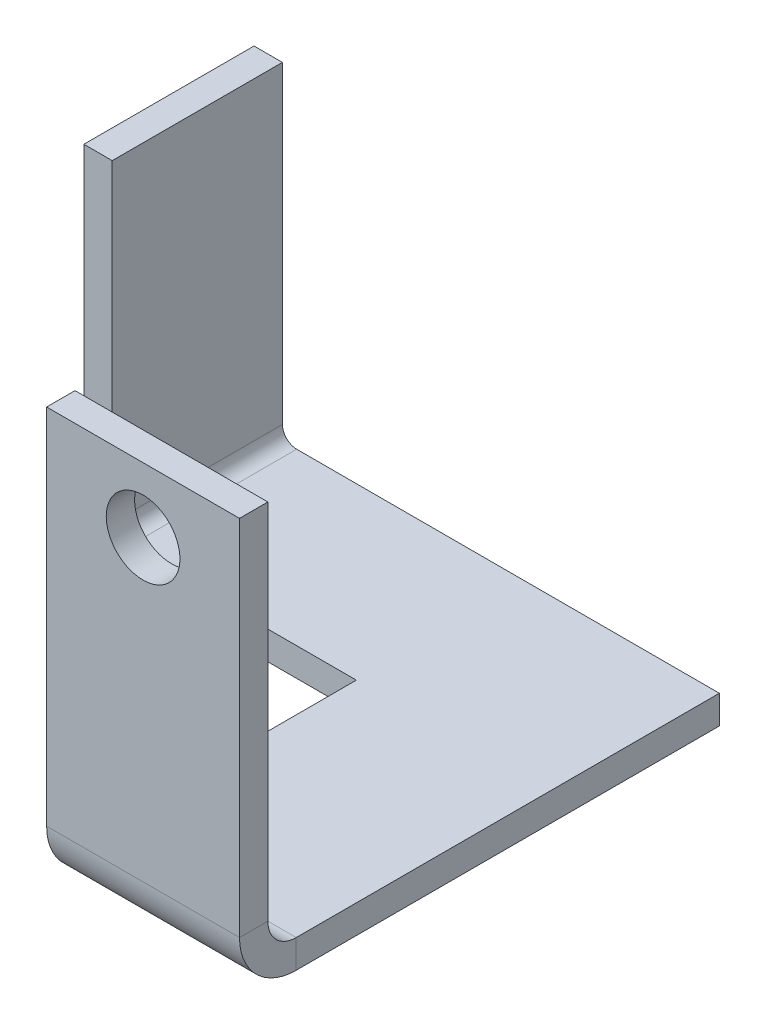
ISO-10303-21;
HEADER;
FILE_DESCRIPTION(('STEP AP214'),'2;1');
FILE_NAME('part.step','',(''),(''),'','','');
FILE_SCHEMA(('AUTOMOTIVE_DESIGN { 1 0 10303 214 1 1 1 1 }'));
ENDSEC;
DATA;
#1=APPLICATION_CONTEXT('core data for automotive mechanical design processes');
#2=APPLICATION_PROTOCOL_DEFINITION('international standard','automotive_design',2000,#1);
#3=PRODUCT_CONTEXT('',#1,'mechanical');
#4=PRODUCT('Part','Part','',(#3));
#5=PRODUCT_RELATED_PRODUCT_CATEGORY('part','',(#4));
#6=PRODUCT_DEFINITION_FORMATION('','',#4);
#7=PRODUCT_DEFINITION_CONTEXT('part definition',#1,'design');
#8=PRODUCT_DEFINITION('design','',#6,#7);
#9=PRODUCT_DEFINITION_SHAPE('','',#8);
#10=(LENGTH_UNIT() NAMED_UNIT(*) SI_UNIT(.MILLI.,.METRE.));
#11=(NAMED_UNIT(*) PLANE_ANGLE_UNIT() SI_UNIT($,.RADIAN.));
#12=(NAMED_UNIT(*) SI_UNIT($,.STERADIAN.) SOLID_ANGLE_UNIT());
#13=UNCERTAINTY_MEASURE_WITH_UNIT(LENGTH_MEASURE(1.E-05),#10,'distance_accuracy_value','');
#14=(GEOMETRIC_REPRESENTATION_CONTEXT(3) GLOBAL_UNCERTAINTY_ASSIGNED_CONTEXT((#13)) GLOBAL_UNIT_ASSIGNED_CONTEXT((#10,
#11,#12)) REPRESENTATION_CONTEXT('',''));
#15=CARTESIAN_POINT('',(0.,0.,0.));
#16=DIRECTION('',(0.,0.,1.));
#17=DIRECTION('',(1.,0.,0.));
#18=AXIS2_PLACEMENT_3D('',#15,#16,#17);
#19=CARTESIAN_POINT('',(0.,0.,0.));
#20=DIRECTION('',(0.,1.,0.));
#21=DIRECTION('',(0.,0.,1.));
#22=AXIS2_PLACEMENT_3D('',#19,#20,#21);
#23=PLANE('',#22);
#24=DIRECTION('',(0.,0.,1.));
#25=VECTOR('',#24,1.);
#26=CARTESIAN_POINT('',(-25.7266450256885,-1.07552855510562E-13,-31.493260102));
#27=LINE('',#26,#25);
#28=CARTESIAN_POINT('',(-25.7266450256885,-1.07552855510562E-13,-31.4932601020001));
#29=VERTEX_POINT('',#28);
#30=CARTESIAN_POINT('',(-25.7266450256885,-1.7650811368064E-13,-50.543260102));
#31=VERTEX_POINT('',#30);
#32=EDGE_CURVE('E198',#29,#31,#27,.F.);
#33=ORIENTED_EDGE('',*,*,#32,.T.);
#34=DIRECTION('',(1.,0.,0.));
#35=VECTOR('',#34,1.);
#36=CARTESIAN_POINT('',(0.,-1.76470849450428E-13,-50.543260102));
#37=LINE('',#36,#35);
#38=CARTESIAN_POINT('',(21.59,-1.76470849450428E-13,-50.543260102));
#39=VERTEX_POINT('',#38);
#40=EDGE_CURVE('E265',#31,#39,#37,.T.);
#41=ORIENTED_EDGE('',*,*,#40,.T.);
#42=DIRECTION('',(0.,0.,1.));
#43=VECTOR('',#42,1.);
#44=CARTESIAN_POINT('',(21.59,0.,0.));
#45=LINE('',#44,#43);
#46=CARTESIAN_POINT('',(21.59,0.,-3.17499999999998));
#47=VERTEX_POINT('',#46);
#48=EDGE_CURVE('E262',#39,#47,#45,.T.);
#49=ORIENTED_EDGE('',*,*,#48,.T.);
#50=DIRECTION('',(-1.,0.,0.));
#51=VECTOR('',#50,1.);
#52=CARTESIAN_POINT('',(21.59,0.,-3.17499999999998));
#53=LINE('',#52,#51);
#54=CARTESIAN_POINT('',(0.,0.,-3.17499999999998));
#55=VERTEX_POINT('',#54);
#56=EDGE_CURVE('E280',#55,#47,#53,.F.);
#57=ORIENTED_EDGE('',*,*,#56,.F.);
#58=DIRECTION('',(0.,0.,-1.));
#59=VECTOR('',#58,1.);
#60=CARTESIAN_POINT('',(0.,0.,0.));
#61=LINE('',#60,#59);
#62=CARTESIAN_POINT('',(0.,-1.09958129945466E-13,-31.493260102));
#63=VERTEX_POINT('',#62);
#64=EDGE_CURVE('E269',#55,#63,#61,.T.);
#65=ORIENTED_EDGE('',*,*,#64,.T.);
#66=DIRECTION('',(-1.,0.,0.));
#67=VECTOR('',#66,1.);
#68=CARTESIAN_POINT('',(0.,-1.09958129945466E-13,-31.493260102));
#69=LINE('',#68,#67);
#70=EDGE_CURVE('E267',#63,#29,#69,.T.);
#71=ORIENTED_EDGE('',*,*,#70,.T.);
#72=EDGE_LOOP('',(#33,#41,#49,#57,#65,#71));
#73=FACE_BOUND('',#72,.T.);
#74=ADVANCED_FACE('F88',(#73),#23,.F.);
#75=CARTESIAN_POINT('',(0.,3.175,0.));
#76=DIRECTION('',(0.,1.,0.));
#77=DIRECTION('',(0.,0.,1.));
#78=AXIS2_PLACEMENT_3D('',#75,#76,#77);
#79=PLANE('',#78);
#80=DIRECTION('',(-1.,0.,0.));
#81=VECTOR('',#80,1.);
#82=CARTESIAN_POINT('',(21.59,3.17499999999982,-50.543260102));
#83=LINE('',#82,#81);
#84=CARTESIAN_POINT('',(-25.7266450256885,3.17499999999982,-50.543260102));
#85=VERTEX_POINT('',#84);
#86=CARTESIAN_POINT('',(21.59,3.17499999999982,-50.543260102));
#87=VERTEX_POINT('',#86);
#88=EDGE_CURVE('E274',#85,#87,#83,.F.);
#89=ORIENTED_EDGE('',*,*,#88,.F.);
#90=DIRECTION('',(0.,0.,1.));
#91=VECTOR('',#90,1.);
#92=CARTESIAN_POINT('',(-25.7266450256885,3.17499999999989,-31.493260102));
#93=LINE('',#92,#91);
#94=CARTESIAN_POINT('',(-25.7266450256885,3.17499999999989,-31.493260102));
#95=VERTEX_POINT('',#94);
#96=EDGE_CURVE('E103',#95,#85,#93,.F.);
#97=ORIENTED_EDGE('',*,*,#96,.F.);
#98=DIRECTION('',(1.,0.,0.));
#99=VECTOR('',#98,1.);
#100=CARTESIAN_POINT('',(-27.3266451276885,3.17499999999989,-31.493260102));
#101=LINE('',#100,#99);
#102=CARTESIAN_POINT('',(0.,3.17499999999989,-31.493260102));
#103=VERTEX_POINT('',#102);
#104=EDGE_CURVE('E276',#103,#95,#101,.F.);
#105=ORIENTED_EDGE('',*,*,#104,.F.);
#106=DIRECTION('',(0.,0.,1.));
#107=VECTOR('',#106,1.);
#108=CARTESIAN_POINT('',(0.,3.17499999999989,-31.493260102));
#109=LINE('',#108,#107);
#110=CARTESIAN_POINT('',(0.,3.17499999999999,-3.17499999999999));
#111=VERTEX_POINT('',#110);
#112=EDGE_CURVE('E278',#111,#103,#109,.F.);
#113=ORIENTED_EDGE('',*,*,#112,.F.);
#114=DIRECTION('',(-1.,0.,0.));
#115=VECTOR('',#114,1.);
#116=CARTESIAN_POINT('',(21.59,3.17499999999999,-3.17499999999999));
#117=LINE('',#116,#115);
#118=CARTESIAN_POINT('',(21.59,3.17499999999999,-3.17499999999999));
#119=VERTEX_POINT('',#118);
#120=EDGE_CURVE('E285',#119,#111,#117,.T.);
#121=ORIENTED_EDGE('',*,*,#120,.F.);
#122=DIRECTION('',(0.,0.,-1.));
#123=VECTOR('',#122,1.);
#124=CARTESIAN_POINT('',(21.59,3.175,0.));
#125=LINE('',#124,#123);
#126=EDGE_CURVE('E271',#87,#119,#125,.F.);
#127=ORIENTED_EDGE('',*,*,#126,.F.);
#128=EDGE_LOOP('',(#89,#97,#105,#113,#121,#127));
#129=FACE_BOUND('',#128,.T.);
#130=ADVANCED_FACE('F359',(#129),#79,.T.);
#131=CARTESIAN_POINT('',(-27.3266451276885,-1.10154940724527E-13,-31.493260102));
#132=DIRECTION('',(0.,0.,-1.));
#133=DIRECTION('',(0.,1.,0.));
#134=AXIS2_PLACEMENT_3D('',#131,#132,#133);
#135=PLANE('',#134);
#136=DIRECTION('',(0.,-1.,0.));
#137=VECTOR('',#136,1.);
#138=CARTESIAN_POINT('',(-25.7266450256885,3.17499999999989,-31.4932601020001));
#139=LINE('',#138,#137);
#140=EDGE_CURVE('E245',#95,#29,#139,.T.);
#141=ORIENTED_EDGE('',*,*,#140,.T.);
#142=ORIENTED_EDGE('',*,*,#70,.F.);
#143=DIRECTION('',(0.,-1.,0.));
#144=VECTOR('',#143,1.);
#145=CARTESIAN_POINT('',(0.,-1.10154940724527E-13,-31.493260102));
#146=LINE('',#145,#144);
#147=EDGE_CURVE('E255',#63,#103,#146,.F.);
#148=ORIENTED_EDGE('',*,*,#147,.T.);
#149=ORIENTED_EDGE('',*,*,#104,.T.);
#150=EDGE_LOOP('',(#141,#142,#148,#149));
#151=FACE_BOUND('',#150,.T.);
#152=ADVANCED_FACE('F397',(#151),#135,.F.);
#153=CARTESIAN_POINT('',(21.59,-1.7650811368064E-13,-50.543260102));
#154=DIRECTION('',(0.,0.,1.));
#155=DIRECTION('',(0.,-1.,0.));
#156=AXIS2_PLACEMENT_3D('',#153,#154,#155);
#157=PLANE('',#156);
#158=DIRECTION('',(0.,-1.,0.));
#159=VECTOR('',#158,1.);
#160=CARTESIAN_POINT('',(-25.7266450256885,3.17499999999983,-50.543260102));
#161=LINE('',#160,#159);
#162=EDGE_CURVE('E111',#85,#31,#161,.T.);
#163=ORIENTED_EDGE('',*,*,#162,.F.);
#164=ORIENTED_EDGE('',*,*,#88,.T.);
#165=DIRECTION('',(0.,1.,0.));
#166=VECTOR('',#165,1.);
#167=CARTESIAN_POINT('',(21.59,-1.76470849450428E-13,-50.543260102));
#168=LINE('',#167,#166);
#169=EDGE_CURVE('E259',#39,#87,#168,.T.);
#170=ORIENTED_EDGE('',*,*,#169,.F.);
#171=ORIENTED_EDGE('',*,*,#40,.F.);
#172=EDGE_LOOP('',(#163,#164,#170,#171));
#173=FACE_BOUND('',#172,.T.);
#174=ADVANCED_FACE('F364',(#173),#157,.F.);
#175=CARTESIAN_POINT('',(0.,0.,3.175));
#176=DIRECTION('',(-1.,0.,0.));
#177=DIRECTION('',(0.,1.,0.));
#178=AXIS2_PLACEMENT_3D('',#175,#176,#177);
#179=PLANE('',#178);
#180=DIRECTION('',(0.,1.,0.));
#181=VECTOR('',#180,1.);
#182=CARTESIAN_POINT('',(0.,0.,0.));
#183=LINE('',#182,#181);
#184=CARTESIAN_POINT('',(0.,6.34999999999999,0.));
#185=VERTEX_POINT('',#184);
#186=CARTESIAN_POINT('',(0.,46.99,0.));
#187=VERTEX_POINT('',#186);
#188=EDGE_CURVE('E325',#185,#187,#183,.T.);
#189=ORIENTED_EDGE('',*,*,#188,.F.);
#190=DIRECTION('',(0.,0.,1.));
#191=VECTOR('',#190,1.);
#192=CARTESIAN_POINT('',(0.,6.34999999999999,0.));
#193=LINE('',#192,#191);
#194=CARTESIAN_POINT('',(0.,6.34999999999999,3.175));
#195=VERTEX_POINT('',#194);
#196=EDGE_CURVE('E295',#185,#195,#193,.T.);
#197=ORIENTED_EDGE('',*,*,#196,.T.);
#198=DIRECTION('',(0.,1.,0.));
#199=VECTOR('',#198,1.);
#200=CARTESIAN_POINT('',(0.,0.,3.175));
#201=LINE('',#200,#199);
#202=CARTESIAN_POINT('',(0.,46.99,3.175));
#203=VERTEX_POINT('',#202);
#204=EDGE_CURVE('E315',#195,#203,#201,.T.);
#205=ORIENTED_EDGE('',*,*,#204,.T.);
#206=DIRECTION('',(0.,0.,1.));
#207=VECTOR('',#206,1.);
#208=CARTESIAN_POINT('',(0.,46.99,3.175));
#209=LINE('',#208,#207);
#210=EDGE_CURVE('E96',#187,#203,#209,.T.);
#211=ORIENTED_EDGE('',*,*,#210,.F.);
#212=EDGE_LOOP('',(#189,#197,#205,#211));
#213=FACE_BOUND('',#212,.T.);
#214=ADVANCED_FACE('F348',(#213),#179,.T.);
#215=CARTESIAN_POINT('',(0.,0.,3.175));
#216=DIRECTION('',(0.,0.,-1.));
#217=DIRECTION('',(-1.,0.,0.));
#218=AXIS2_PLACEMENT_3D('',#215,#216,#217);
#219=PLANE('',#218);
#220=CARTESIAN_POINT('',(10.795,39.7298015993552,3.175));
#221=DIRECTION('',(0.,0.,-1.));
#222=DIRECTION('',(-1.,0.,0.));
#223=AXIS2_PLACEMENT_3D('',#220,#221,#222);
#224=CIRCLE('',#223,4.124999878);
#225=CARTESIAN_POINT('',(6.670000122,39.7298015993552,3.175));
#226=VERTEX_POINT('',#225);
#227=EDGE_CURVE('E312',#226,#226,#224,.T.);
#228=ORIENTED_EDGE('',*,*,#227,.T.);
#229=EDGE_LOOP('',(#228));
#230=FACE_BOUND('',#229,.T.);
#231=DIRECTION('',(-1.,0.,0.));
#232=VECTOR('',#231,1.);
#233=CARTESIAN_POINT('',(0.,6.34999999999999,3.175));
#234=LINE('',#233,#232);
#235=CARTESIAN_POINT('',(21.59,6.34999999999999,3.175));
#236=VERTEX_POINT('',#235);
#237=EDGE_CURVE('E289',#195,#236,#234,.F.);
#238=ORIENTED_EDGE('',*,*,#237,.T.);
#239=DIRECTION('',(0.,1.,0.));
#240=VECTOR('',#239,1.);
#241=CARTESIAN_POINT('',(21.59,0.,3.175));
#242=LINE('',#241,#240);
#243=CARTESIAN_POINT('',(21.59,46.99,3.175));
#244=VERTEX_POINT('',#243);
#245=EDGE_CURVE('E318',#236,#244,#242,.T.);
#246=ORIENTED_EDGE('',*,*,#245,.T.);
#247=DIRECTION('',(1.,0.,0.));
#248=VECTOR('',#247,1.);
#249=CARTESIAN_POINT('',(0.,46.99,3.175));
#250=LINE('',#249,#248);
#251=EDGE_CURVE('E320',#203,#244,#250,.T.);
#252=ORIENTED_EDGE('',*,*,#251,.F.);
#253=ORIENTED_EDGE('',*,*,#204,.F.);
#254=EDGE_LOOP('',(#238,#246,#252,#253));
#255=FACE_BOUND('',#254,.T.);
#256=ADVANCED_FACE('F340',(#230,#255),#219,.F.);
#257=CARTESIAN_POINT('',(0.,0.,0.));
#258=DIRECTION('',(0.,0.,-1.));
#259=DIRECTION('',(-1.,0.,0.));
#260=AXIS2_PLACEMENT_3D('',#257,#258,#259);
#261=PLANE('',#260);
#262=CARTESIAN_POINT('',(10.795,39.7298015993552,0.));
#263=DIRECTION('',(0.,0.,-1.));
#264=DIRECTION('',(-1.,0.,0.));
#265=AXIS2_PLACEMENT_3D('',#262,#263,#264);
#266=CIRCLE('',#265,4.124999878);
#267=CARTESIAN_POINT('',(6.670000122,39.7298015993552,0.));
#268=VERTEX_POINT('',#267);
#269=EDGE_CURVE('E309',#268,#268,#266,.T.);
#270=ORIENTED_EDGE('',*,*,#269,.F.);
#271=EDGE_LOOP('',(#270));
#272=FACE_BOUND('',#271,.T.);
#273=DIRECTION('',(0.,1.,0.));
#274=VECTOR('',#273,1.);
#275=CARTESIAN_POINT('',(21.59,0.,0.));
#276=LINE('',#275,#274);
#277=CARTESIAN_POINT('',(21.59,6.34999999999999,0.));
#278=VERTEX_POINT('',#277);
#279=CARTESIAN_POINT('',(21.59,46.99,0.));
#280=VERTEX_POINT('',#279);
#281=EDGE_CURVE('E327',#278,#280,#276,.T.);
#282=ORIENTED_EDGE('',*,*,#281,.F.);
#283=DIRECTION('',(-1.,0.,0.));
#284=VECTOR('',#283,1.);
#285=CARTESIAN_POINT('',(0.,6.34999999999999,0.));
#286=LINE('',#285,#284);
#287=EDGE_CURVE('E301',#185,#278,#286,.F.);
#288=ORIENTED_EDGE('',*,*,#287,.F.);
#289=ORIENTED_EDGE('',*,*,#188,.T.);
#290=DIRECTION('',(-1.,0.,0.));
#291=VECTOR('',#290,1.);
#292=CARTESIAN_POINT('',(0.,46.99,0.));
#293=LINE('',#292,#291);
#294=EDGE_CURVE('E316',#187,#280,#293,.F.);
#295=ORIENTED_EDGE('',*,*,#294,.T.);
#296=EDGE_LOOP('',(#282,#288,#289,#295));
#297=FACE_BOUND('',#296,.T.);
#298=ADVANCED_FACE('F346',(#272,#297),#261,.T.);
#299=CARTESIAN_POINT('',(21.59,0.,3.175));
#300=DIRECTION('',(-1.,0.,0.));
#301=DIRECTION('',(0.,1.,0.));
#302=AXIS2_PLACEMENT_3D('',#299,#300,#301);
#303=PLANE('',#302);
#304=DIRECTION('',(0.,0.,1.));
#305=VECTOR('',#304,1.);
#306=CARTESIAN_POINT('',(21.59,6.34999999999999,0.));
#307=LINE('',#306,#305);
#308=EDGE_CURVE('E306',#278,#236,#307,.T.);
#309=ORIENTED_EDGE('',*,*,#308,.F.);
#310=ORIENTED_EDGE('',*,*,#281,.T.);
#311=DIRECTION('',(0.,0.,1.));
#312=VECTOR('',#311,1.);
#313=CARTESIAN_POINT('',(21.59,46.99,3.175));
#314=LINE('',#313,#312);
#315=EDGE_CURVE('E13',#280,#244,#314,.T.);
#316=ORIENTED_EDGE('',*,*,#315,.T.);
#317=ORIENTED_EDGE('',*,*,#245,.F.);
#318=EDGE_LOOP('',(#309,#310,#316,#317));
#319=FACE_BOUND('',#318,.T.);
#320=ADVANCED_FACE('F90',(#319),#303,.F.);
#321=CARTESIAN_POINT('',(0.,46.99,3.175));
#322=DIRECTION('',(0.,1.,0.));
#323=DIRECTION('',(1.,0.,0.));
#324=AXIS2_PLACEMENT_3D('',#321,#322,#323);
#325=PLANE('',#324);
#326=ORIENTED_EDGE('',*,*,#315,.F.);
#327=ORIENTED_EDGE('',*,*,#294,.F.);
#328=ORIENTED_EDGE('',*,*,#210,.T.);
#329=ORIENTED_EDGE('',*,*,#251,.T.);
#330=EDGE_LOOP('',(#326,#327,#328,#329));
#331=FACE_BOUND('',#330,.T.);
#332=ADVANCED_FACE('F336',(#331),#325,.T.);
#333=CARTESIAN_POINT('',(10.795,39.7298015993552,3.175));
#334=DIRECTION('',(0.,0.,-1.));
#335=DIRECTION('',(-1.,0.,0.));
#336=AXIS2_PLACEMENT_3D('',#333,#334,#335);
#337=CYLINDRICAL_SURFACE('',#336,4.124999878);
#338=ORIENTED_EDGE('',*,*,#227,.F.);
#339=EDGE_LOOP('',(#338));
#340=FACE_BOUND('',#339,.T.);
#341=ORIENTED_EDGE('',*,*,#269,.T.);
#342=EDGE_LOOP('',(#341));
#343=FACE_BOUND('',#342,.T.);
#344=ADVANCED_FACE('F422',(#340,#343),#337,.F.);
#345=CARTESIAN_POINT('',(21.59,6.34999999999999,-3.175));
#346=DIRECTION('',(1.,0.,0.));
#347=DIRECTION('',(0.,1.,0.));
#348=AXIS2_PLACEMENT_3D('',#345,#346,#347);
#349=PLANE('',#348);
#350=DIRECTION('',(0.,1.,0.));
#351=VECTOR('',#350,1.);
#352=CARTESIAN_POINT('',(21.59,0.,-3.17499999999998));
#353=LINE('',#352,#351);
#354=EDGE_CURVE('E252',#119,#47,#353,.F.);
#355=ORIENTED_EDGE('',*,*,#354,.F.);
#356=CARTESIAN_POINT('',(21.59,6.34999999999999,-3.175));
#357=DIRECTION('',(-1.,0.,0.));
#358=DIRECTION('',(0.,-1.,0.));
#359=AXIS2_PLACEMENT_3D('',#356,#357,#358);
#360=CIRCLE('',#359,3.175);
#361=EDGE_CURVE('E298',#278,#119,#360,.F.);
#362=ORIENTED_EDGE('',*,*,#361,.F.);
#363=ORIENTED_EDGE('',*,*,#308,.T.);
#364=CARTESIAN_POINT('',(21.59,6.34999999999999,-3.175));
#365=DIRECTION('',(-1.,0.,0.));
#366=DIRECTION('',(0.,-1.,0.));
#367=AXIS2_PLACEMENT_3D('',#364,#365,#366);
#368=CIRCLE('',#367,6.35);
#369=EDGE_CURVE('E291',#236,#47,#368,.F.);
#370=ORIENTED_EDGE('',*,*,#369,.T.);
#371=EDGE_LOOP('',(#355,#362,#363,#370));
#372=FACE_BOUND('',#371,.T.);
#373=ADVANCED_FACE('F419',(#372),#349,.T.);
#374=CARTESIAN_POINT('',(0.,6.34999999999999,-3.175));
#375=DIRECTION('',(1.,0.,0.));
#376=DIRECTION('',(0.,1.,0.));
#377=AXIS2_PLACEMENT_3D('',#374,#375,#376);
#378=PLANE('',#377);
#379=CARTESIAN_POINT('',(0.,6.34999999999999,-3.175));
#380=DIRECTION('',(-1.,0.,0.));
#381=DIRECTION('',(0.,-1.,0.));
#382=AXIS2_PLACEMENT_3D('',#379,#380,#381);
#383=CIRCLE('',#382,3.175);
#384=EDGE_CURVE('E258',#111,#185,#383,.T.);
#385=ORIENTED_EDGE('',*,*,#384,.F.);
#386=DIRECTION('',(0.,1.,0.));
#387=VECTOR('',#386,1.);
#388=CARTESIAN_POINT('',(0.,3.17499999999999,-3.17499999999999));
#389=LINE('',#388,#387);
#390=EDGE_CURVE('E282',#111,#55,#389,.F.);
#391=ORIENTED_EDGE('',*,*,#390,.T.);
#392=CARTESIAN_POINT('',(0.,6.34999999999999,-3.175));
#393=DIRECTION('',(-1.,0.,0.));
#394=DIRECTION('',(0.,-1.,0.));
#395=AXIS2_PLACEMENT_3D('',#392,#393,#394);
#396=CIRCLE('',#395,6.35);
#397=EDGE_CURVE('E292',#55,#195,#396,.T.);
#398=ORIENTED_EDGE('',*,*,#397,.T.);
#399=ORIENTED_EDGE('',*,*,#196,.F.);
#400=EDGE_LOOP('',(#385,#391,#398,#399));
#401=FACE_BOUND('',#400,.T.);
#402=ADVANCED_FACE('F351',(#401),#378,.F.);
#403=CARTESIAN_POINT('',(0.,6.34999999999999,-3.175));
#404=DIRECTION('',(-1.,0.,0.));
#405=DIRECTION('',(0.,-1.,0.));
#406=AXIS2_PLACEMENT_3D('',#403,#404,#405);
#407=CYLINDRICAL_SURFACE('',#406,6.35);
#408=ORIENTED_EDGE('',*,*,#237,.F.);
#409=ORIENTED_EDGE('',*,*,#397,.F.);
#410=ORIENTED_EDGE('',*,*,#56,.T.);
#411=ORIENTED_EDGE('',*,*,#369,.F.);
#412=EDGE_LOOP('',(#408,#409,#410,#411));
#413=FACE_BOUND('',#412,.T.);
#414=ADVANCED_FACE('F413',(#413),#407,.T.);
#415=CARTESIAN_POINT('',(0.,6.34999999999999,-3.175));
#416=DIRECTION('',(-1.,0.,0.));
#417=DIRECTION('',(0.,-1.,0.));
#418=AXIS2_PLACEMENT_3D('',#415,#416,#417);
#419=CYLINDRICAL_SURFACE('',#418,3.175);
#420=ORIENTED_EDGE('',*,*,#287,.T.);
#421=ORIENTED_EDGE('',*,*,#361,.T.);
#422=ORIENTED_EDGE('',*,*,#120,.T.);
#423=ORIENTED_EDGE('',*,*,#384,.T.);
#424=EDGE_LOOP('',(#420,#421,#422,#423));
#425=FACE_BOUND('',#424,.T.);
#426=ADVANCED_FACE('F354',(#425),#419,.F.);
#427=CARTESIAN_POINT('',(0.,-1.10154940724527E-13,-31.493260102));
#428=DIRECTION('',(1.,0.,0.));
#429=DIRECTION('',(0.,0.,-1.));
#430=AXIS2_PLACEMENT_3D('',#427,#428,#429);
#431=PLANE('',#430);
#432=ORIENTED_EDGE('',*,*,#390,.F.);
#433=ORIENTED_EDGE('',*,*,#112,.T.);
#434=ORIENTED_EDGE('',*,*,#147,.F.);
#435=ORIENTED_EDGE('',*,*,#64,.F.);
#436=EDGE_LOOP('',(#432,#433,#434,#435));
#437=FACE_BOUND('',#436,.T.);
#438=ADVANCED_FACE('F404',(#437),#431,.F.);
#439=CARTESIAN_POINT('',(21.59,0.,0.));
#440=DIRECTION('',(-1.,0.,0.));
#441=DIRECTION('',(0.,0.,1.));
#442=AXIS2_PLACEMENT_3D('',#439,#440,#441);
#443=PLANE('',#442);
#444=ORIENTED_EDGE('',*,*,#354,.T.);
#445=ORIENTED_EDGE('',*,*,#48,.F.);
#446=ORIENTED_EDGE('',*,*,#169,.T.);
#447=ORIENTED_EDGE('',*,*,#126,.T.);
#448=EDGE_LOOP('',(#444,#445,#446,#447));
#449=FACE_BOUND('',#448,.T.);
#450=ADVANCED_FACE('F361',(#449),#443,.F.);
#451=CARTESIAN_POINT('',(-25.7266450256885,4.77500010199982,-50.543260102));
#452=DIRECTION('',(0.,0.,-1.));
#453=DIRECTION('',(0.,1.,0.));
#454=AXIS2_PLACEMENT_3D('',#451,#452,#453);
#455=PLANE('',#454);
#456=DIRECTION('',(-1.,0.,0.));
#457=VECTOR('',#456,1.);
#458=CARTESIAN_POINT('',(-27.3266451276885,4.77500010199982,-50.5432601020001));
#459=LINE('',#458,#457);
#460=CARTESIAN_POINT('',(-27.3266451276885,4.77500010199982,-50.543260102));
#461=VERTEX_POINT('',#460);
#462=CARTESIAN_POINT('',(-30.5016451276885,4.77500010199981,-50.543260102));
#463=VERTEX_POINT('',#462);
#464=EDGE_CURVE('E372',#461,#463,#459,.T.);
#465=ORIENTED_EDGE('',*,*,#464,.F.);
#466=CARTESIAN_POINT('',(-25.7266450256885,4.77500010199982,-50.543260102));
#467=DIRECTION('',(0.,0.,1.));
#468=DIRECTION('',(0.,-1.,0.));
#469=AXIS2_PLACEMENT_3D('',#466,#467,#468);
#470=CIRCLE('',#469,1.600000102);
#471=EDGE_CURVE('E201',#85,#461,#470,.F.);
#472=ORIENTED_EDGE('',*,*,#471,.F.);
#473=ORIENTED_EDGE('',*,*,#162,.T.);
#474=CARTESIAN_POINT('',(-25.7266450256885,4.77500010199982,-50.543260102));
#475=DIRECTION('',(0.,0.,1.));
#476=DIRECTION('',(0.,-1.,0.));
#477=AXIS2_PLACEMENT_3D('',#474,#475,#476);
#478=CIRCLE('',#477,4.775000102);
#479=EDGE_CURVE('E244',#31,#463,#478,.F.);
#480=ORIENTED_EDGE('',*,*,#479,.T.);
#481=EDGE_LOOP('',(#465,#472,#473,#480));
#482=FACE_BOUND('',#481,.T.);
#483=ADVANCED_FACE('F370',(#482),#455,.T.);
#484=CARTESIAN_POINT('',(-25.7266450256885,4.77500010199989,-31.4932601020001));
#485=DIRECTION('',(0.,0.,-1.));
#486=DIRECTION('',(0.,1.,0.));
#487=AXIS2_PLACEMENT_3D('',#484,#485,#486);
#488=PLANE('',#487);
#489=CARTESIAN_POINT('',(-25.7266450256885,4.77500010199989,-31.4932601020001));
#490=DIRECTION('',(0.,0.,1.));
#491=DIRECTION('',(0.,-1.,0.));
#492=AXIS2_PLACEMENT_3D('',#489,#490,#491);
#493=CIRCLE('',#492,1.600000102);
#494=CARTESIAN_POINT('',(-27.3266451276885,4.77500010199989,-31.4932601020001));
#495=VERTEX_POINT('',#494);
#496=EDGE_CURVE('E208',#495,#95,#493,.T.);
#497=ORIENTED_EDGE('',*,*,#496,.F.);
#498=DIRECTION('',(-1.,0.,0.));
#499=VECTOR('',#498,1.);
#500=CARTESIAN_POINT('',(-27.3266451276885,4.77500010199989,-31.4932601020001));
#501=LINE('',#500,#499);
#502=CARTESIAN_POINT('',(-30.5016451276885,4.77500010199987,-31.4932601020001));
#503=VERTEX_POINT('',#502);
#504=EDGE_CURVE('E205',#495,#503,#501,.T.);
#505=ORIENTED_EDGE('',*,*,#504,.T.);
#506=CARTESIAN_POINT('',(-25.7266450256885,4.77500010199989,-31.4932601020001));
#507=DIRECTION('',(0.,0.,1.));
#508=DIRECTION('',(0.,-1.,0.));
#509=AXIS2_PLACEMENT_3D('',#506,#507,#508);
#510=CIRCLE('',#509,4.775000102);
#511=EDGE_CURVE('E190',#503,#29,#510,.T.);
#512=ORIENTED_EDGE('',*,*,#511,.T.);
#513=ORIENTED_EDGE('',*,*,#140,.F.);
#514=EDGE_LOOP('',(#497,#505,#512,#513));
#515=FACE_BOUND('',#514,.T.);
#516=ADVANCED_FACE('F206',(#515),#488,.F.);
#517=CARTESIAN_POINT('',(-25.7266450256885,4.77500010199989,-31.493260102));
#518=DIRECTION('',(0.,0.,1.));
#519=DIRECTION('',(-1.,0.,0.));
#520=AXIS2_PLACEMENT_3D('',#517,#518,#519);
#521=CYLINDRICAL_SURFACE('',#520,4.775000102);
#522=ORIENTED_EDGE('',*,*,#32,.F.);
#523=ORIENTED_EDGE('',*,*,#511,.F.);
#524=DIRECTION('',(0.,0.,-1.));
#525=VECTOR('',#524,1.);
#526=CARTESIAN_POINT('',(-30.5016451276885,4.77500010199998,0.));
#527=LINE('',#526,#525);
#528=EDGE_CURVE('E195',#503,#463,#527,.T.);
#529=ORIENTED_EDGE('',*,*,#528,.T.);
#530=ORIENTED_EDGE('',*,*,#479,.F.);
#531=EDGE_LOOP('',(#522,#523,#529,#530));
#532=FACE_BOUND('',#531,.T.);
#533=ADVANCED_FACE('F192',(#532),#521,.T.);
#534=CARTESIAN_POINT('',(-25.7266450256885,4.77500010199989,-31.493260102));
#535=DIRECTION('',(0.,0.,1.));
#536=DIRECTION('',(-1.,0.,0.));
#537=AXIS2_PLACEMENT_3D('',#534,#535,#536);
#538=CYLINDRICAL_SURFACE('',#537,1.600000102);
#539=ORIENTED_EDGE('',*,*,#96,.T.);
#540=ORIENTED_EDGE('',*,*,#471,.T.);
#541=DIRECTION('',(0.,0.,1.));
#542=VECTOR('',#541,1.);
#543=CARTESIAN_POINT('',(-27.3266451276885,4.77500010199982,-50.5432601020001));
#544=LINE('',#543,#542);
#545=EDGE_CURVE('E212',#461,#495,#544,.T.);
#546=ORIENTED_EDGE('',*,*,#545,.T.);
#547=ORIENTED_EDGE('',*,*,#496,.T.);
#548=EDGE_LOOP('',(#539,#540,#546,#547));
#549=FACE_BOUND('',#548,.T.);
#550=ADVANCED_FACE('F367',(#549),#538,.F.);
#551=CARTESIAN_POINT('',(-30.5016451276886,39.8779999999999,-31.4932601020001));
#552=DIRECTION('',(0.,0.,-1.));
#553=DIRECTION('',(0.,1.,0.));
#554=AXIS2_PLACEMENT_3D('',#551,#552,#553);
#555=PLANE('',#554);
#556=ORIENTED_EDGE('',*,*,#504,.F.);
#557=DIRECTION('',(0.,1.,0.));
#558=VECTOR('',#557,1.);
#559=CARTESIAN_POINT('',(-27.3266451276886,39.8779999999999,-31.4932601020001));
#560=LINE('',#559,#558);
#561=CARTESIAN_POINT('',(-27.3266451276886,39.8779999999999,-31.4932601020001));
#562=VERTEX_POINT('',#561);
#563=EDGE_CURVE('E221',#495,#562,#560,.T.);
#564=ORIENTED_EDGE('',*,*,#563,.T.);
#565=DIRECTION('',(1.,0.,0.));
#566=VECTOR('',#565,1.);
#567=CARTESIAN_POINT('',(-30.5016451276886,39.8779999999999,-31.4932601020001));
#568=LINE('',#567,#566);
#569=CARTESIAN_POINT('',(-30.5016451276886,39.8779999999999,-31.4932601020001));
#570=VERTEX_POINT('',#569);
#571=EDGE_CURVE('E226',#570,#562,#568,.T.);
#572=ORIENTED_EDGE('',*,*,#571,.F.);
#573=DIRECTION('',(0.,1.,0.));
#574=VECTOR('',#573,1.);
#575=CARTESIAN_POINT('',(-30.5016451276886,39.8779999999999,-31.4932601020001));
#576=LINE('',#575,#574);
#577=EDGE_CURVE('E217',#503,#570,#576,.T.);
#578=ORIENTED_EDGE('',*,*,#577,.F.);
#579=EDGE_LOOP('',(#556,#564,#572,#578));
#580=FACE_BOUND('',#579,.T.);
#581=ADVANCED_FACE('F224',(#580),#555,.F.);
#582=CARTESIAN_POINT('',(-30.5016451276885,3.17499999999981,-50.543260102));
#583=DIRECTION('',(0.,0.,1.));
#584=DIRECTION('',(0.,-1.,0.));
#585=AXIS2_PLACEMENT_3D('',#582,#583,#584);
#586=PLANE('',#585);
#587=ORIENTED_EDGE('',*,*,#464,.T.);
#588=DIRECTION('',(0.,-1.,0.));
#589=VECTOR('',#588,1.);
#590=CARTESIAN_POINT('',(-30.5016451276885,3.17499999999981,-50.543260102));
#591=LINE('',#590,#589);
#592=CARTESIAN_POINT('',(-30.5016451276886,39.8779999999998,-50.5432601020001));
#593=VERTEX_POINT('',#592);
#594=EDGE_CURVE('E220',#593,#463,#591,.T.);
#595=ORIENTED_EDGE('',*,*,#594,.F.);
#596=DIRECTION('',(1.,0.,0.));
#597=VECTOR('',#596,1.);
#598=CARTESIAN_POINT('',(-30.5016451276886,39.8779999999998,-50.5432601020001));
#599=LINE('',#598,#597);
#600=CARTESIAN_POINT('',(-27.3266451276886,39.8779999999999,-50.5432601020001));
#601=VERTEX_POINT('',#600);
#602=EDGE_CURVE('E237',#593,#601,#599,.T.);
#603=ORIENTED_EDGE('',*,*,#602,.T.);
#604=DIRECTION('',(0.,-1.,0.));
#605=VECTOR('',#604,1.);
#606=CARTESIAN_POINT('',(-27.3266451276885,3.17499999999982,-50.543260102));
#607=LINE('',#606,#605);
#608=EDGE_CURVE('E228',#601,#461,#607,.T.);
#609=ORIENTED_EDGE('',*,*,#608,.T.);
#610=EDGE_LOOP('',(#587,#595,#603,#609));
#611=FACE_BOUND('',#610,.T.);
#612=ADVANCED_FACE('F379',(#611),#586,.F.);
#613=CARTESIAN_POINT('',(-30.5016451276885,-1.06660986282975E-13,0.));
#614=DIRECTION('',(1.,0.,0.));
#615=DIRECTION('',(0.,1.,0.));
#616=AXIS2_PLACEMENT_3D('',#613,#614,#615);
#617=PLANE('',#616);
#618=ORIENTED_EDGE('',*,*,#528,.F.);
#619=ORIENTED_EDGE('',*,*,#577,.T.);
#620=DIRECTION('',(0.,0.,-1.));
#621=VECTOR('',#620,1.);
#622=CARTESIAN_POINT('',(-30.5016451276886,39.8779999999998,-50.5432601020001));
#623=LINE('',#622,#621);
#624=EDGE_CURVE('E227',#570,#593,#623,.T.);
#625=ORIENTED_EDGE('',*,*,#624,.T.);
#626=ORIENTED_EDGE('',*,*,#594,.T.);
#627=EDGE_LOOP('',(#618,#619,#625,#626));
#628=FACE_BOUND('',#627,.T.);
#629=ADVANCED_FACE('F216',(#628),#617,.F.);
#630=CARTESIAN_POINT('',(-27.3266451276885,0.,0.));
#631=DIRECTION('',(1.,0.,0.));
#632=DIRECTION('',(0.,1.,0.));
#633=AXIS2_PLACEMENT_3D('',#630,#631,#632);
#634=PLANE('',#633);
#635=ORIENTED_EDGE('',*,*,#563,.F.);
#636=ORIENTED_EDGE('',*,*,#545,.F.);
#637=ORIENTED_EDGE('',*,*,#608,.F.);
#638=DIRECTION('',(0.,0.,-1.));
#639=VECTOR('',#638,1.);
#640=CARTESIAN_POINT('',(-27.3266451276886,39.8779999999999,-50.5432601020001));
#641=LINE('',#640,#639);
#642=EDGE_CURVE('E232',#562,#601,#641,.T.);
#643=ORIENTED_EDGE('',*,*,#642,.F.);
#644=EDGE_LOOP('',(#635,#636,#637,#643));
#645=FACE_BOUND('',#644,.T.);
#646=ADVANCED_FACE('F377',(#645),#634,.T.);
#647=CARTESIAN_POINT('',(-30.5016451276886,39.8779999999998,-50.5432601020001));
#648=DIRECTION('',(0.,-1.,0.));
#649=DIRECTION('',(1.,0.,0.));
#650=AXIS2_PLACEMENT_3D('',#647,#648,#649);
#651=PLANE('',#650);
#652=ORIENTED_EDGE('',*,*,#642,.T.);
#653=ORIENTED_EDGE('',*,*,#602,.F.);
#654=ORIENTED_EDGE('',*,*,#624,.F.);
#655=ORIENTED_EDGE('',*,*,#571,.T.);
#656=EDGE_LOOP('',(#652,#653,#654,#655));
#657=FACE_BOUND('',#656,.T.);
#658=ADVANCED_FACE('F382',(#657),#651,.F.);
#659=CLOSED_SHELL('',(#74,#130,#152,#174,#214,#256,#298,#320,#332,#344,#373,#402,#414,#426,#438,
#450,#483,#516,#533,#550,#581,#612,#629,#646,#658));
#660=MANIFOLD_SOLID_BREP('B2',#659);
#661=ADVANCED_BREP_SHAPE_REPRESENTATION('',(#18,#660),#14);
#662=SHAPE_DEFINITION_REPRESENTATION(#9,#661);
ENDSEC;
END-ISO-10303-21;
